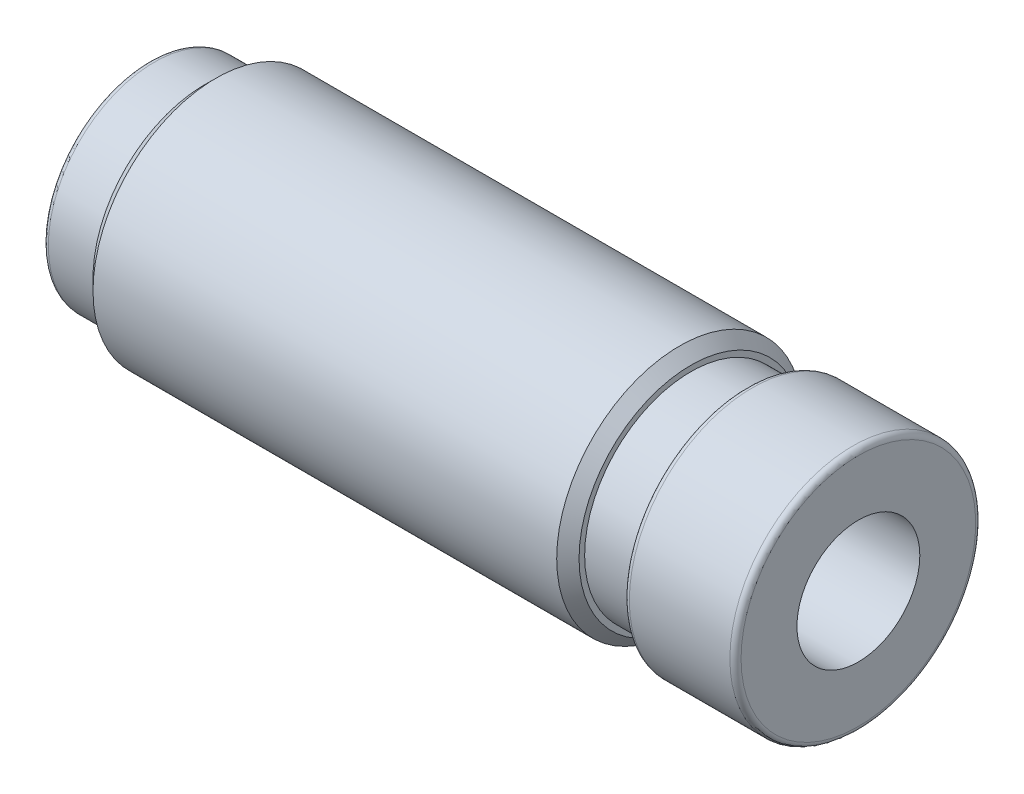
ISO-10303-21;
HEADER;
FILE_DESCRIPTION(('STEP AP214'),'2;1');
FILE_NAME('part.step','',(''),(''),'','','');
FILE_SCHEMA(('AUTOMOTIVE_DESIGN { 1 0 10303 214 1 1 1 1 }'));
ENDSEC;
DATA;
#1=APPLICATION_CONTEXT('core data for automotive mechanical design processes');
#2=APPLICATION_PROTOCOL_DEFINITION('international standard','automotive_design',2000,#1);
#3=PRODUCT_CONTEXT('',#1,'mechanical');
#4=PRODUCT('Part','Part','',(#3));
#5=PRODUCT_RELATED_PRODUCT_CATEGORY('part','',(#4));
#6=PRODUCT_DEFINITION_FORMATION('','',#4);
#7=PRODUCT_DEFINITION_CONTEXT('part definition',#1,'design');
#8=PRODUCT_DEFINITION('design','',#6,#7);
#9=PRODUCT_DEFINITION_SHAPE('','',#8);
#10=(LENGTH_UNIT() NAMED_UNIT(*) SI_UNIT(.MILLI.,.METRE.));
#11=(NAMED_UNIT(*) PLANE_ANGLE_UNIT() SI_UNIT($,.RADIAN.));
#12=(NAMED_UNIT(*) SI_UNIT($,.STERADIAN.) SOLID_ANGLE_UNIT());
#13=UNCERTAINTY_MEASURE_WITH_UNIT(LENGTH_MEASURE(1.E-05),#10,'distance_accuracy_value','');
#14=(GEOMETRIC_REPRESENTATION_CONTEXT(3) GLOBAL_UNCERTAINTY_ASSIGNED_CONTEXT((#13)) GLOBAL_UNIT_ASSIGNED_CONTEXT((#10,
#11,#12)) REPRESENTATION_CONTEXT('',''));
#15=CARTESIAN_POINT('',(0.,0.,0.));
#16=DIRECTION('',(0.,0.,1.));
#17=DIRECTION('',(1.,0.,0.));
#18=AXIS2_PLACEMENT_3D('',#15,#16,#17);
#19=CARTESIAN_POINT('',(0.,9.5,0.));
#20=DIRECTION('',(1.,0.,0.));
#21=DIRECTION('',(0.,0.,-1.));
#22=AXIS2_PLACEMENT_3D('',#19,#20,#21);
#23=PLANE('',#22);
#24=CARTESIAN_POINT('',(0.,0.,0.));
#25=DIRECTION('',(1.,0.,0.));
#26=DIRECTION('',(0.,0.,-1.));
#27=AXIS2_PLACEMENT_3D('',#24,#25,#26);
#28=CIRCLE('',#27,9.);
#29=CARTESIAN_POINT('',(0.,0.,-9.));
#30=VERTEX_POINT('',#29);
#31=EDGE_CURVE('E57',#30,#30,#28,.F.);
#32=ORIENTED_EDGE('',*,*,#31,.T.);
#33=EDGE_LOOP('',(#32));
#34=FACE_BOUND('',#33,.T.);
#35=CARTESIAN_POINT('',(0.,0.,0.));
#36=DIRECTION('',(1.,0.,0.));
#37=DIRECTION('',(0.,0.,-1.));
#38=AXIS2_PLACEMENT_3D('',#35,#36,#37);
#39=CIRCLE('',#38,5.20000000000001);
#40=CARTESIAN_POINT('',(0.,0.,-5.20000000000001));
#41=VERTEX_POINT('',#40);
#42=EDGE_CURVE('E60',#41,#41,#39,.T.);
#43=ORIENTED_EDGE('',*,*,#42,.T.);
#44=EDGE_LOOP('',(#43));
#45=FACE_BOUND('',#44,.T.);
#46=ADVANCED_FACE('F34',(#34,#45),#23,.F.);
#47=CARTESIAN_POINT('',(63.5,0.,0.));
#48=DIRECTION('',(-1.,0.,0.));
#49=DIRECTION('',(0.,0.,1.));
#50=AXIS2_PLACEMENT_3D('',#47,#48,#49);
#51=PLANE('',#50);
#52=CARTESIAN_POINT('',(63.5,0.,0.));
#53=DIRECTION('',(-1.,0.,0.));
#54=DIRECTION('',(0.,0.,1.));
#55=AXIS2_PLACEMENT_3D('',#52,#53,#54);
#56=CIRCLE('',#55,10.5);
#57=CARTESIAN_POINT('',(63.5,0.,10.5));
#58=VERTEX_POINT('',#57);
#59=EDGE_CURVE('E66',#58,#58,#56,.F.);
#60=ORIENTED_EDGE('',*,*,#59,.T.);
#61=EDGE_LOOP('',(#60));
#62=FACE_BOUND('',#61,.T.);
#63=CARTESIAN_POINT('',(63.5,0.,0.));
#64=DIRECTION('',(1.,0.,0.));
#65=DIRECTION('',(0.,0.,-1.));
#66=AXIS2_PLACEMENT_3D('',#63,#64,#65);
#67=CIRCLE('',#66,5.50000000000001);
#68=CARTESIAN_POINT('',(63.5,0.,-5.50000000000001));
#69=VERTEX_POINT('',#68);
#70=EDGE_CURVE('E82',#69,#69,#67,.T.);
#71=ORIENTED_EDGE('',*,*,#70,.F.);
#72=EDGE_LOOP('',(#71));
#73=FACE_BOUND('',#72,.T.);
#74=ADVANCED_FACE('F99',(#62,#73),#51,.F.);
#75=CARTESIAN_POINT('',(0.,0.,0.));
#76=DIRECTION('',(-1.,0.,0.));
#77=DIRECTION('',(0.,0.,1.));
#78=AXIS2_PLACEMENT_3D('',#75,#76,#77);
#79=CYLINDRICAL_SURFACE('',#78,11.);
#80=CARTESIAN_POINT('',(54.,0.,0.));
#81=DIRECTION('',(1.,0.,0.));
#82=DIRECTION('',(0.,0.,-1.));
#83=AXIS2_PLACEMENT_3D('',#80,#81,#82);
#84=CIRCLE('',#83,11.);
#85=CARTESIAN_POINT('',(54.,0.,-11.));
#86=VERTEX_POINT('',#85);
#87=EDGE_CURVE('E69',#86,#86,#84,.T.);
#88=ORIENTED_EDGE('',*,*,#87,.T.);
#89=EDGE_LOOP('',(#88));
#90=FACE_BOUND('',#89,.T.);
#91=CARTESIAN_POINT('',(63.,0.,0.));
#92=DIRECTION('',(-1.,0.,0.));
#93=DIRECTION('',(0.,0.,1.));
#94=AXIS2_PLACEMENT_3D('',#91,#92,#93);
#95=CIRCLE('',#94,11.);
#96=CARTESIAN_POINT('',(63.,0.,11.));
#97=VERTEX_POINT('',#96);
#98=EDGE_CURVE('E72',#97,#97,#95,.T.);
#99=ORIENTED_EDGE('',*,*,#98,.T.);
#100=EDGE_LOOP('',(#99));
#101=FACE_BOUND('',#100,.T.);
#102=ADVANCED_FACE('F101',(#90,#101),#79,.T.);
#103=CARTESIAN_POINT('',(53.5,11.,0.));
#104=DIRECTION('',(1.,0.,0.));
#105=DIRECTION('',(0.,0.,-1.));
#106=AXIS2_PLACEMENT_3D('',#103,#104,#105);
#107=PLANE('',#106);
#108=CARTESIAN_POINT('',(53.5,0.,0.));
#109=DIRECTION('',(1.,0.,0.));
#110=DIRECTION('',(0.,0.,-1.));
#111=AXIS2_PLACEMENT_3D('',#108,#109,#110);
#112=CIRCLE('',#111,10.5);
#113=CARTESIAN_POINT('',(53.5,0.,-10.5));
#114=VERTEX_POINT('',#113);
#115=EDGE_CURVE('E75',#114,#114,#112,.F.);
#116=ORIENTED_EDGE('',*,*,#115,.T.);
#117=EDGE_LOOP('',(#116));
#118=FACE_BOUND('',#117,.T.);
#119=CARTESIAN_POINT('',(53.5,0.,0.));
#120=DIRECTION('',(-1.,0.,0.));
#121=DIRECTION('',(0.,0.,1.));
#122=AXIS2_PLACEMENT_3D('',#119,#120,#121);
#123=CIRCLE('',#122,9.5);
#124=CARTESIAN_POINT('',(53.5,0.,9.5));
#125=VERTEX_POINT('',#124);
#126=EDGE_CURVE('E78',#125,#125,#123,.T.);
#127=ORIENTED_EDGE('',*,*,#126,.F.);
#128=EDGE_LOOP('',(#127));
#129=FACE_BOUND('',#128,.T.);
#130=ADVANCED_FACE('F108',(#118,#129),#107,.F.);
#131=CARTESIAN_POINT('',(0.,0.,0.));
#132=DIRECTION('',(-1.,0.,0.));
#133=DIRECTION('',(0.,0.,1.));
#134=AXIS2_PLACEMENT_3D('',#131,#132,#133);
#135=CYLINDRICAL_SURFACE('',#134,9.5);
#136=CARTESIAN_POINT('',(48.5,0.,0.));
#137=DIRECTION('',(-1.,0.,0.));
#138=DIRECTION('',(0.,0.,1.));
#139=AXIS2_PLACEMENT_3D('',#136,#137,#138);
#140=CIRCLE('',#139,9.5);
#141=CARTESIAN_POINT('',(48.5,0.,9.5));
#142=VERTEX_POINT('',#141);
#143=EDGE_CURVE('E85',#142,#142,#140,.T.);
#144=ORIENTED_EDGE('',*,*,#143,.F.);
#145=EDGE_LOOP('',(#144));
#146=FACE_BOUND('',#145,.T.);
#147=ORIENTED_EDGE('',*,*,#126,.T.);
#148=EDGE_LOOP('',(#147));
#149=FACE_BOUND('',#148,.T.);
#150=ADVANCED_FACE('F155',(#146,#149),#135,.T.);
#151=CARTESIAN_POINT('',(48.5,9.5,0.));
#152=DIRECTION('',(-1.,0.,0.));
#153=DIRECTION('',(0.,0.,1.));
#154=AXIS2_PLACEMENT_3D('',#151,#152,#153);
#155=PLANE('',#154);
#156=CARTESIAN_POINT('',(48.5,0.,0.));
#157=DIRECTION('',(-1.,0.,0.));
#158=DIRECTION('',(0.,0.,1.));
#159=AXIS2_PLACEMENT_3D('',#156,#157,#158);
#160=CIRCLE('',#159,9.99999999999999);
#161=CARTESIAN_POINT('',(48.5,0.,9.99999999999999));
#162=VERTEX_POINT('',#161);
#163=EDGE_CURVE('E41',#162,#162,#160,.F.);
#164=ORIENTED_EDGE('',*,*,#163,.T.);
#165=EDGE_LOOP('',(#164));
#166=FACE_BOUND('',#165,.T.);
#167=ORIENTED_EDGE('',*,*,#143,.T.);
#168=EDGE_LOOP('',(#167));
#169=FACE_BOUND('',#168,.T.);
#170=ADVANCED_FACE('F145',(#166,#169),#155,.F.);
#171=CARTESIAN_POINT('',(0.,0.,0.));
#172=DIRECTION('',(-1.,0.,0.));
#173=DIRECTION('',(0.,0.,1.));
#174=AXIS2_PLACEMENT_3D('',#171,#172,#173);
#175=CYLINDRICAL_SURFACE('',#174,11.);
#176=CARTESIAN_POINT('',(47.5,0.,0.));
#177=DIRECTION('',(-1.,0.,0.));
#178=DIRECTION('',(0.,0.,1.));
#179=AXIS2_PLACEMENT_3D('',#176,#177,#178);
#180=CIRCLE('',#179,11.);
#181=CARTESIAN_POINT('',(47.5,0.,11.));
#182=VERTEX_POINT('',#181);
#183=EDGE_CURVE('E45',#182,#182,#180,.T.);
#184=ORIENTED_EDGE('',*,*,#183,.T.);
#185=EDGE_LOOP('',(#184));
#186=FACE_BOUND('',#185,.T.);
#187=CARTESIAN_POINT('',(6.00000000000001,0.,0.));
#188=DIRECTION('',(1.,0.,0.));
#189=DIRECTION('',(0.,0.,-1.));
#190=AXIS2_PLACEMENT_3D('',#187,#188,#189);
#191=CIRCLE('',#190,11.);
#192=CARTESIAN_POINT('',(6.00000000000001,0.,-11.));
#193=VERTEX_POINT('',#192);
#194=EDGE_CURVE('E49',#193,#193,#191,.T.);
#195=ORIENTED_EDGE('',*,*,#194,.T.);
#196=EDGE_LOOP('',(#195));
#197=FACE_BOUND('',#196,.T.);
#198=ADVANCED_FACE('F141',(#186,#197),#175,.T.);
#199=CARTESIAN_POINT('',(5.,11.,0.));
#200=DIRECTION('',(1.,0.,0.));
#201=DIRECTION('',(0.,0.,-1.));
#202=AXIS2_PLACEMENT_3D('',#199,#200,#201);
#203=PLANE('',#202);
#204=CARTESIAN_POINT('',(5.,0.,0.));
#205=DIRECTION('',(1.,0.,0.));
#206=DIRECTION('',(0.,0.,-1.));
#207=AXIS2_PLACEMENT_3D('',#204,#205,#206);
#208=CIRCLE('',#207,9.99999999999999);
#209=CARTESIAN_POINT('',(5.,0.,-9.99999999999999));
#210=VERTEX_POINT('',#209);
#211=EDGE_CURVE('E10',#210,#210,#208,.F.);
#212=ORIENTED_EDGE('',*,*,#211,.T.);
#213=EDGE_LOOP('',(#212));
#214=FACE_BOUND('',#213,.T.);
#215=CARTESIAN_POINT('',(5.,0.,0.));
#216=DIRECTION('',(-1.,0.,0.));
#217=DIRECTION('',(0.,0.,1.));
#218=AXIS2_PLACEMENT_3D('',#215,#216,#217);
#219=CIRCLE('',#218,9.5);
#220=CARTESIAN_POINT('',(5.,0.,9.5));
#221=VERTEX_POINT('',#220);
#222=EDGE_CURVE('E88',#221,#221,#219,.T.);
#223=ORIENTED_EDGE('',*,*,#222,.F.);
#224=EDGE_LOOP('',(#223));
#225=FACE_BOUND('',#224,.T.);
#226=ADVANCED_FACE('F144',(#214,#225),#203,.F.);
#227=CARTESIAN_POINT('',(0.,0.,0.));
#228=DIRECTION('',(-1.,0.,0.));
#229=DIRECTION('',(0.,0.,1.));
#230=AXIS2_PLACEMENT_3D('',#227,#228,#229);
#231=CYLINDRICAL_SURFACE('',#230,9.5);
#232=CARTESIAN_POINT('',(0.5,0.,0.));
#233=DIRECTION('',(1.,0.,0.));
#234=DIRECTION('',(0.,0.,-1.));
#235=AXIS2_PLACEMENT_3D('',#232,#233,#234);
#236=CIRCLE('',#235,9.5);
#237=CARTESIAN_POINT('',(0.5,0.,-9.5));
#238=VERTEX_POINT('',#237);
#239=EDGE_CURVE('E54',#238,#238,#236,.T.);
#240=ORIENTED_EDGE('',*,*,#239,.T.);
#241=EDGE_LOOP('',(#240));
#242=FACE_BOUND('',#241,.T.);
#243=ORIENTED_EDGE('',*,*,#222,.T.);
#244=EDGE_LOOP('',(#243));
#245=FACE_BOUND('',#244,.T.);
#246=ADVANCED_FACE('F153',(#242,#245),#231,.T.);
#247=CARTESIAN_POINT('',(7.8,0.,0.));
#248=DIRECTION('',(-1.,0.,0.));
#249=DIRECTION('',(0.,0.,1.));
#250=AXIS2_PLACEMENT_3D('',#247,#248,#249);
#251=PLANE('',#250);
#252=CARTESIAN_POINT('',(7.8,0.,0.));
#253=DIRECTION('',(-1.,0.,0.));
#254=DIRECTION('',(0.,0.,1.));
#255=AXIS2_PLACEMENT_3D('',#252,#253,#254);
#256=CIRCLE('',#255,4.70000000000001);
#257=CARTESIAN_POINT('',(7.8,0.,4.70000000000001));
#258=VERTEX_POINT('',#257);
#259=EDGE_CURVE('E79',#258,#258,#256,.T.);
#260=ORIENTED_EDGE('',*,*,#259,.T.);
#261=EDGE_LOOP('',(#260));
#262=FACE_BOUND('',#261,.T.);
#263=CARTESIAN_POINT('',(7.8,0.,0.));
#264=DIRECTION('',(1.,0.,0.));
#265=DIRECTION('',(0.,0.,-1.));
#266=AXIS2_PLACEMENT_3D('',#263,#264,#265);
#267=CIRCLE('',#266,5.50000000000001);
#268=CARTESIAN_POINT('',(7.8,0.,-5.50000000000001));
#269=VERTEX_POINT('',#268);
#270=EDGE_CURVE('E91',#269,#269,#267,.T.);
#271=ORIENTED_EDGE('',*,*,#270,.T.);
#272=EDGE_LOOP('',(#271));
#273=FACE_BOUND('',#272,.T.);
#274=ADVANCED_FACE('F243',(#262,#273),#251,.F.);
#275=CARTESIAN_POINT('',(63.5,0.,0.));
#276=DIRECTION('',(1.,0.,0.));
#277=DIRECTION('',(0.,0.,-1.));
#278=AXIS2_PLACEMENT_3D('',#275,#276,#277);
#279=CYLINDRICAL_SURFACE('',#278,5.50000000000001);
#280=ORIENTED_EDGE('',*,*,#270,.F.);
#281=EDGE_LOOP('',(#280));
#282=FACE_BOUND('',#281,.T.);
#283=ORIENTED_EDGE('',*,*,#70,.T.);
#284=EDGE_LOOP('',(#283));
#285=FACE_BOUND('',#284,.T.);
#286=ADVANCED_FACE('F97',(#282,#285),#279,.F.);
#287=CARTESIAN_POINT('',(0.,0.,0.));
#288=DIRECTION('',(-1.,0.,0.));
#289=DIRECTION('',(0.,0.,1.));
#290=AXIS2_PLACEMENT_3D('',#287,#288,#289);
#291=CYLINDRICAL_SURFACE('',#290,4.70000000000001);
#292=CARTESIAN_POINT('',(0.5,0.,0.));
#293=DIRECTION('',(1.,0.,0.));
#294=DIRECTION('',(0.,0.,-1.));
#295=AXIS2_PLACEMENT_3D('',#292,#293,#294);
#296=CIRCLE('',#295,4.70000000000001);
#297=CARTESIAN_POINT('',(0.5,0.,-4.70000000000001));
#298=VERTEX_POINT('',#297);
#299=EDGE_CURVE('E63',#298,#298,#296,.F.);
#300=ORIENTED_EDGE('',*,*,#299,.T.);
#301=EDGE_LOOP('',(#300));
#302=FACE_BOUND('',#301,.T.);
#303=ORIENTED_EDGE('',*,*,#259,.F.);
#304=EDGE_LOOP('',(#303));
#305=FACE_BOUND('',#304,.T.);
#306=ADVANCED_FACE('F119',(#302,#305),#291,.F.);
#307=CARTESIAN_POINT('',(54.,0.,0.));
#308=DIRECTION('',(1.,0.,0.));
#309=DIRECTION('',(0.,0.,-1.));
#310=AXIS2_PLACEMENT_3D('',#307,#308,#309);
#311=TOROIDAL_SURFACE('',#310,10.5,0.5);
#312=ORIENTED_EDGE('',*,*,#87,.F.);
#313=EDGE_LOOP('',(#312));
#314=FACE_BOUND('',#313,.T.);
#315=ORIENTED_EDGE('',*,*,#115,.F.);
#316=EDGE_LOOP('',(#315));
#317=FACE_BOUND('',#316,.T.);
#318=ADVANCED_FACE('F115',(#314,#317),#311,.T.);
#319=CARTESIAN_POINT('',(63.,0.,0.));
#320=DIRECTION('',(-1.,0.,0.));
#321=DIRECTION('',(0.,0.,1.));
#322=AXIS2_PLACEMENT_3D('',#319,#320,#321);
#323=TOROIDAL_SURFACE('',#322,10.5,0.5);
#324=ORIENTED_EDGE('',*,*,#59,.F.);
#325=EDGE_LOOP('',(#324));
#326=FACE_BOUND('',#325,.T.);
#327=ORIENTED_EDGE('',*,*,#98,.F.);
#328=EDGE_LOOP('',(#327));
#329=FACE_BOUND('',#328,.T.);
#330=ADVANCED_FACE('F118',(#326,#329),#323,.T.);
#331=CARTESIAN_POINT('',(0.5,0.,0.));
#332=DIRECTION('',(1.,0.,0.));
#333=DIRECTION('',(0.,0.,-1.));
#334=AXIS2_PLACEMENT_3D('',#331,#332,#333);
#335=TOROIDAL_SURFACE('',#334,5.20000000000001,0.5);
#336=ORIENTED_EDGE('',*,*,#42,.F.);
#337=EDGE_LOOP('',(#336));
#338=FACE_BOUND('',#337,.T.);
#339=ORIENTED_EDGE('',*,*,#299,.F.);
#340=EDGE_LOOP('',(#339));
#341=FACE_BOUND('',#340,.T.);
#342=ADVANCED_FACE('F123',(#338,#341),#335,.T.);
#343=CARTESIAN_POINT('',(0.5,0.,0.));
#344=DIRECTION('',(1.,0.,0.));
#345=DIRECTION('',(0.,0.,-1.));
#346=AXIS2_PLACEMENT_3D('',#343,#344,#345);
#347=TOROIDAL_SURFACE('',#346,9.,0.5);
#348=ORIENTED_EDGE('',*,*,#239,.F.);
#349=EDGE_LOOP('',(#348));
#350=FACE_BOUND('',#349,.T.);
#351=ORIENTED_EDGE('',*,*,#31,.F.);
#352=EDGE_LOOP('',(#351));
#353=FACE_BOUND('',#352,.T.);
#354=ADVANCED_FACE('F127',(#350,#353),#347,.T.);
#355=CARTESIAN_POINT('',(47.5,0.,0.));
#356=DIRECTION('',(-1.,0.,0.));
#357=DIRECTION('',(0.,0.,1.));
#358=AXIS2_PLACEMENT_3D('',#355,#356,#357);
#359=CONICAL_SURFACE('',#358,11.,0.785398163397452);
#360=ORIENTED_EDGE('',*,*,#163,.F.);
#361=EDGE_LOOP('',(#360));
#362=FACE_BOUND('',#361,.T.);
#363=ORIENTED_EDGE('',*,*,#183,.F.);
#364=EDGE_LOOP('',(#363));
#365=FACE_BOUND('',#364,.T.);
#366=ADVANCED_FACE('F130',(#362,#365),#359,.T.);
#367=CARTESIAN_POINT('',(5.,0.,0.));
#368=DIRECTION('',(1.,0.,0.));
#369=DIRECTION('',(0.,0.,-1.));
#370=AXIS2_PLACEMENT_3D('',#367,#368,#369);
#371=CONICAL_SURFACE('',#370,9.99999999999999,0.785398163397447);
#372=ORIENTED_EDGE('',*,*,#194,.F.);
#373=EDGE_LOOP('',(#372));
#374=FACE_BOUND('',#373,.T.);
#375=ORIENTED_EDGE('',*,*,#211,.F.);
#376=EDGE_LOOP('',(#375));
#377=FACE_BOUND('',#376,.T.);
#378=ADVANCED_FACE('F36',(#374,#377),#371,.T.);
#379=CLOSED_SHELL('',(#46,#74,#102,#130,#150,#170,#198,#226,#246,#274,#286,#306,#318,#330,#342,
#354,#366,#378));
#380=MANIFOLD_SOLID_BREP('B2',#379);
#381=ADVANCED_BREP_SHAPE_REPRESENTATION('',(#18,#380),#14);
#382=SHAPE_DEFINITION_REPRESENTATION(#9,#381);
ENDSEC;
END-ISO-10303-21;
